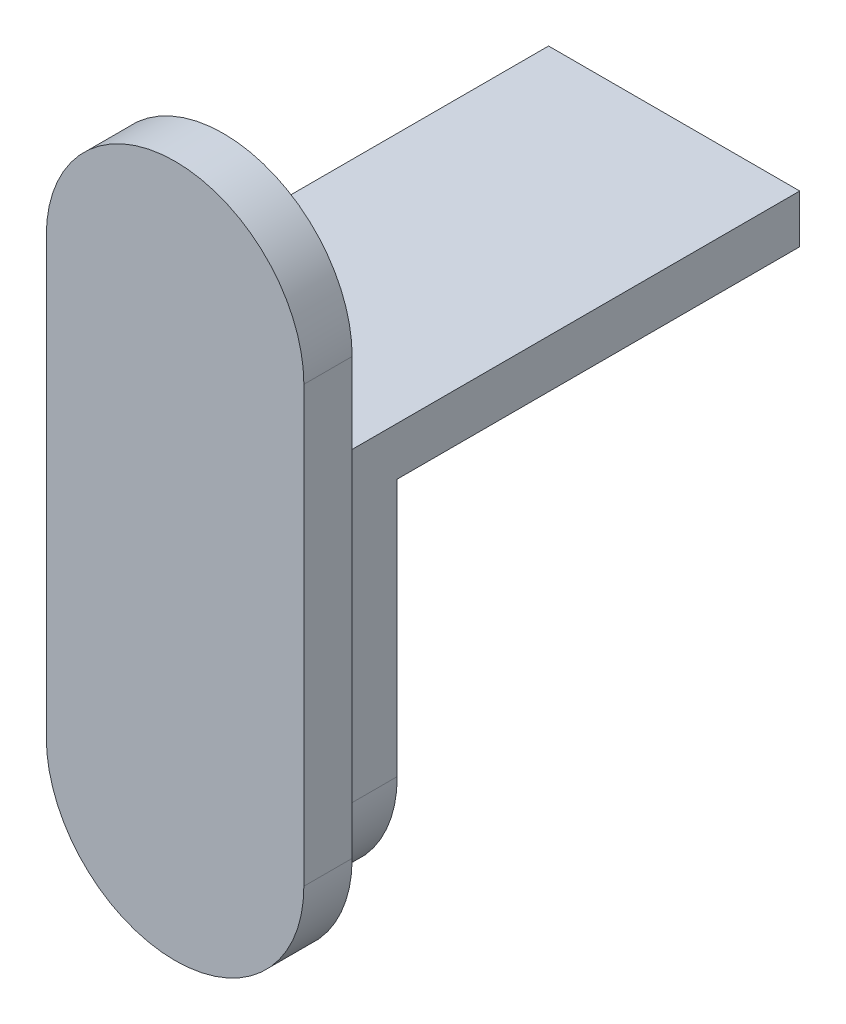
ISO-10303-21;
HEADER;
FILE_DESCRIPTION(('STEP AP214'),'2;1');
FILE_NAME('part.step','',(''),(''),'','','');
FILE_SCHEMA(('AUTOMOTIVE_DESIGN { 1 0 10303 214 1 1 1 1 }'));
ENDSEC;
DATA;
#1=APPLICATION_CONTEXT('core data for automotive mechanical design processes');
#2=APPLICATION_PROTOCOL_DEFINITION('international standard','automotive_design',2000,#1);
#3=PRODUCT_CONTEXT('',#1,'mechanical');
#4=PRODUCT('Part','Part','',(#3));
#5=PRODUCT_RELATED_PRODUCT_CATEGORY('part','',(#4));
#6=PRODUCT_DEFINITION_FORMATION('','',#4);
#7=PRODUCT_DEFINITION_CONTEXT('part definition',#1,'design');
#8=PRODUCT_DEFINITION('design','',#6,#7);
#9=PRODUCT_DEFINITION_SHAPE('','',#8);
#10=(LENGTH_UNIT() NAMED_UNIT(*) SI_UNIT(.MILLI.,.METRE.));
#11=(NAMED_UNIT(*) PLANE_ANGLE_UNIT() SI_UNIT($,.RADIAN.));
#12=(NAMED_UNIT(*) SI_UNIT($,.STERADIAN.) SOLID_ANGLE_UNIT());
#13=UNCERTAINTY_MEASURE_WITH_UNIT(LENGTH_MEASURE(1.E-05),#10,'distance_accuracy_value','');
#14=(GEOMETRIC_REPRESENTATION_CONTEXT(3) GLOBAL_UNCERTAINTY_ASSIGNED_CONTEXT((#13)) GLOBAL_UNIT_ASSIGNED_CONTEXT((#10,
#11,#12)) REPRESENTATION_CONTEXT('',''));
#15=CARTESIAN_POINT('',(0.,0.,0.));
#16=DIRECTION('',(0.,0.,1.));
#17=DIRECTION('',(1.,0.,0.));
#18=AXIS2_PLACEMENT_3D('',#15,#16,#17);
#19=CARTESIAN_POINT('',(0.,-20.,3.));
#20=DIRECTION('',(0.,0.,-1.));
#21=DIRECTION('',(1.,0.,0.));
#22=AXIS2_PLACEMENT_3D('',#19,#20,#21);
#23=CYLINDRICAL_SURFACE('',#22,8.);
#24=CARTESIAN_POINT('',(0.,-20.,0.));
#25=DIRECTION('',(0.,0.,-1.));
#26=DIRECTION('',(-1.,0.,0.));
#27=AXIS2_PLACEMENT_3D('',#24,#25,#26);
#28=CIRCLE('',#27,8.);
#29=CARTESIAN_POINT('',(8.,-20.,0.));
#30=VERTEX_POINT('',#29);
#31=CARTESIAN_POINT('',(-8.,-20.,0.));
#32=VERTEX_POINT('',#31);
#33=EDGE_CURVE('E124',#30,#32,#28,.T.);
#34=ORIENTED_EDGE('',*,*,#33,.F.);
#35=DIRECTION('',(0.,0.,-1.));
#36=VECTOR('',#35,1.);
#37=CARTESIAN_POINT('',(8.,-20.,3.));
#38=LINE('',#37,#36);
#39=CARTESIAN_POINT('',(8.,-20.,3.));
#40=VERTEX_POINT('',#39);
#41=EDGE_CURVE('E123',#40,#30,#38,.T.);
#42=ORIENTED_EDGE('',*,*,#41,.F.);
#43=CARTESIAN_POINT('',(0.,-20.,3.));
#44=DIRECTION('',(0.,0.,-1.));
#45=DIRECTION('',(-1.,0.,0.));
#46=AXIS2_PLACEMENT_3D('',#43,#44,#45);
#47=CIRCLE('',#46,8.);
#48=CARTESIAN_POINT('',(-8.,-20.,3.));
#49=VERTEX_POINT('',#48);
#50=EDGE_CURVE('E118',#40,#49,#47,.T.);
#51=ORIENTED_EDGE('',*,*,#50,.T.);
#52=DIRECTION('',(0.,0.,-1.));
#53=VECTOR('',#52,1.);
#54=CARTESIAN_POINT('',(-8.,-20.,3.));
#55=LINE('',#54,#53);
#56=EDGE_CURVE('E12',#49,#32,#55,.T.);
#57=ORIENTED_EDGE('',*,*,#56,.T.);
#58=EDGE_LOOP('',(#34,#42,#51,#57));
#59=FACE_BOUND('',#58,.T.);
#60=ADVANCED_FACE('F61',(#59),#23,.T.);
#61=CARTESIAN_POINT('',(-8.,-20.,3.));
#62=DIRECTION('',(1.,0.,0.));
#63=DIRECTION('',(0.,0.,1.));
#64=AXIS2_PLACEMENT_3D('',#61,#62,#63);
#65=PLANE('',#64);
#66=DIRECTION('',(0.,1.,0.));
#67=VECTOR('',#66,1.);
#68=CARTESIAN_POINT('',(-8.,-20.,0.));
#69=LINE('',#68,#67);
#70=CARTESIAN_POINT('',(-8.,7.00000000000002,0.));
#71=VERTEX_POINT('',#70);
#72=EDGE_CURVE('E126',#32,#71,#69,.T.);
#73=ORIENTED_EDGE('',*,*,#72,.F.);
#74=ORIENTED_EDGE('',*,*,#56,.F.);
#75=DIRECTION('',(0.,1.,0.));
#76=VECTOR('',#75,1.);
#77=CARTESIAN_POINT('',(-8.,-20.,3.));
#78=LINE('',#77,#76);
#79=CARTESIAN_POINT('',(-8.,7.00000000000002,3.));
#80=VERTEX_POINT('',#79);
#81=EDGE_CURVE('E102',#49,#80,#78,.T.);
#82=ORIENTED_EDGE('',*,*,#81,.T.);
#83=DIRECTION('',(0.,0.,-1.));
#84=VECTOR('',#83,1.);
#85=CARTESIAN_POINT('',(-8.,7.00000000000002,3.));
#86=LINE('',#85,#84);
#87=EDGE_CURVE('E69',#80,#71,#86,.T.);
#88=ORIENTED_EDGE('',*,*,#87,.T.);
#89=EDGE_LOOP('',(#73,#74,#82,#88));
#90=FACE_BOUND('',#89,.T.);
#91=ADVANCED_FACE('F116',(#90),#65,.F.);
#92=CARTESIAN_POINT('',(0.,7.00000000000001,3.));
#93=DIRECTION('',(0.,0.,-1.));
#94=DIRECTION('',(1.,0.,0.));
#95=AXIS2_PLACEMENT_3D('',#92,#93,#94);
#96=CYLINDRICAL_SURFACE('',#95,8.);
#97=CARTESIAN_POINT('',(0.,7.00000000000001,0.));
#98=DIRECTION('',(0.,0.,1.));
#99=DIRECTION('',(1.,0.,0.));
#100=AXIS2_PLACEMENT_3D('',#97,#98,#99);
#101=CIRCLE('',#100,8.);
#102=CARTESIAN_POINT('',(8.,7.00000000000001,0.));
#103=VERTEX_POINT('',#102);
#104=EDGE_CURVE('E112',#103,#71,#101,.T.);
#105=ORIENTED_EDGE('',*,*,#104,.T.);
#106=ORIENTED_EDGE('',*,*,#87,.F.);
#107=CARTESIAN_POINT('',(0.,7.00000000000001,3.));
#108=DIRECTION('',(0.,0.,1.));
#109=DIRECTION('',(1.,0.,0.));
#110=AXIS2_PLACEMENT_3D('',#107,#108,#109);
#111=CIRCLE('',#110,8.);
#112=CARTESIAN_POINT('',(8.,7.00000000000001,3.));
#113=VERTEX_POINT('',#112);
#114=EDGE_CURVE('E105',#113,#80,#111,.T.);
#115=ORIENTED_EDGE('',*,*,#114,.F.);
#116=DIRECTION('',(0.,0.,-1.));
#117=VECTOR('',#116,1.);
#118=CARTESIAN_POINT('',(8.,7.00000000000001,3.));
#119=LINE('',#118,#117);
#120=EDGE_CURVE('E115',#113,#103,#119,.T.);
#121=ORIENTED_EDGE('',*,*,#120,.T.);
#122=EDGE_LOOP('',(#105,#106,#115,#121));
#123=FACE_BOUND('',#122,.T.);
#124=ADVANCED_FACE('F111',(#123),#96,.T.);
#125=CARTESIAN_POINT('',(8.,-20.,3.));
#126=DIRECTION('',(1.,0.,0.));
#127=DIRECTION('',(0.,0.,1.));
#128=AXIS2_PLACEMENT_3D('',#125,#126,#127);
#129=PLANE('',#128);
#130=DIRECTION('',(0.,1.,0.));
#131=VECTOR('',#130,1.);
#132=CARTESIAN_POINT('',(8.,-20.,0.));
#133=LINE('',#132,#131);
#134=EDGE_CURVE('E91',#30,#103,#133,.T.);
#135=ORIENTED_EDGE('',*,*,#134,.T.);
#136=ORIENTED_EDGE('',*,*,#120,.F.);
#137=DIRECTION('',(0.,1.,0.));
#138=VECTOR('',#137,1.);
#139=CARTESIAN_POINT('',(8.,-20.,3.));
#140=LINE('',#139,#138);
#141=EDGE_CURVE('E77',#40,#113,#140,.T.);
#142=ORIENTED_EDGE('',*,*,#141,.F.);
#143=ORIENTED_EDGE('',*,*,#41,.T.);
#144=EDGE_LOOP('',(#135,#136,#142,#143));
#145=FACE_BOUND('',#144,.T.);
#146=ADVANCED_FACE('F135',(#145),#129,.T.);
#147=CARTESIAN_POINT('',(0.,-20.,3.));
#148=DIRECTION('',(0.,0.,1.));
#149=DIRECTION('',(-1.,0.,0.));
#150=AXIS2_PLACEMENT_3D('',#147,#148,#149);
#151=PLANE('',#150);
#152=ORIENTED_EDGE('',*,*,#50,.F.);
#153=ORIENTED_EDGE('',*,*,#141,.T.);
#154=ORIENTED_EDGE('',*,*,#114,.T.);
#155=ORIENTED_EDGE('',*,*,#81,.F.);
#156=EDGE_LOOP('',(#152,#153,#154,#155));
#157=FACE_BOUND('',#156,.T.);
#158=ADVANCED_FACE('F107',(#157),#151,.T.);
#159=CARTESIAN_POINT('',(0.,-20.,0.));
#160=DIRECTION('',(0.,0.,1.));
#161=DIRECTION('',(-1.,0.,0.));
#162=AXIS2_PLACEMENT_3D('',#159,#160,#161);
#163=PLANE('',#162);
#164=ORIENTED_EDGE('',*,*,#33,.T.);
#165=ORIENTED_EDGE('',*,*,#72,.T.);
#166=ORIENTED_EDGE('',*,*,#104,.F.);
#167=ORIENTED_EDGE('',*,*,#134,.F.);
#168=EDGE_LOOP('',(#164,#165,#166,#167));
#169=FACE_BOUND('',#168,.T.);
#170=ADVANCED_FACE('F131',(#169),#163,.F.);
#171=CLOSED_SHELL('',(#60,#91,#124,#146,#158,#170));
#172=MANIFOLD_SOLID_BREP('B2',#171);
#173=CARTESIAN_POINT('',(0.,-17.2,-3.));
#174=DIRECTION('',(0.,0.,1.));
#175=DIRECTION('',(-1.,0.,0.));
#176=AXIS2_PLACEMENT_3D('',#173,#174,#175);
#177=CYLINDRICAL_SURFACE('',#176,7.8);
#178=CARTESIAN_POINT('',(0.,-17.2,0.));
#179=DIRECTION('',(0.,0.,1.));
#180=DIRECTION('',(1.,0.,0.));
#181=AXIS2_PLACEMENT_3D('',#178,#179,#180);
#182=CIRCLE('',#181,7.8);
#183=CARTESIAN_POINT('',(-7.8,-17.2,0.));
#184=VERTEX_POINT('',#183);
#185=CARTESIAN_POINT('',(7.8,-17.2,0.));
#186=VERTEX_POINT('',#185);
#187=EDGE_CURVE('E263',#184,#186,#182,.T.);
#188=ORIENTED_EDGE('',*,*,#187,.F.);
#189=DIRECTION('',(0.,0.,1.));
#190=VECTOR('',#189,1.);
#191=CARTESIAN_POINT('',(-7.8,-17.2,-3.));
#192=LINE('',#191,#190);
#193=CARTESIAN_POINT('',(-7.8,-17.2,-3.));
#194=VERTEX_POINT('',#193);
#195=EDGE_CURVE('E205',#194,#184,#192,.T.);
#196=ORIENTED_EDGE('',*,*,#195,.F.);
#197=CARTESIAN_POINT('',(0.,-17.2,-3.));
#198=DIRECTION('',(0.,0.,1.));
#199=DIRECTION('',(1.,0.,0.));
#200=AXIS2_PLACEMENT_3D('',#197,#198,#199);
#201=CIRCLE('',#200,7.8);
#202=CARTESIAN_POINT('',(7.8,-17.2,-3.));
#203=VERTEX_POINT('',#202);
#204=EDGE_CURVE('E245',#194,#203,#201,.T.);
#205=ORIENTED_EDGE('',*,*,#204,.T.);
#206=DIRECTION('',(0.,0.,1.));
#207=VECTOR('',#206,1.);
#208=CARTESIAN_POINT('',(7.8,-17.2,-3.));
#209=LINE('',#208,#207);
#210=EDGE_CURVE('E59',#203,#186,#209,.T.);
#211=ORIENTED_EDGE('',*,*,#210,.T.);
#212=EDGE_LOOP('',(#188,#196,#205,#211));
#213=FACE_BOUND('',#212,.T.);
#214=ADVANCED_FACE('F197',(#213),#177,.T.);
#215=CARTESIAN_POINT('',(7.8,0.,-3.));
#216=DIRECTION('',(-1.,0.,0.));
#217=DIRECTION('',(0.,0.,-1.));
#218=AXIS2_PLACEMENT_3D('',#215,#216,#217);
#219=PLANE('',#218);
#220=DIRECTION('',(0.,1.,0.));
#221=VECTOR('',#220,1.);
#222=CARTESIAN_POINT('',(7.8,0.,0.));
#223=LINE('',#222,#221);
#224=CARTESIAN_POINT('',(7.8,1.8,0.));
#225=VERTEX_POINT('',#224);
#226=EDGE_CURVE('E226',#186,#225,#223,.T.);
#227=ORIENTED_EDGE('',*,*,#226,.F.);
#228=ORIENTED_EDGE('',*,*,#210,.F.);
#229=DIRECTION('',(0.,1.,0.));
#230=VECTOR('',#229,1.);
#231=CARTESIAN_POINT('',(7.8,0.,-3.));
#232=LINE('',#231,#230);
#233=CARTESIAN_POINT('',(7.8,-1.2,-3.));
#234=VERTEX_POINT('',#233);
#235=EDGE_CURVE('E242',#203,#234,#232,.T.);
#236=ORIENTED_EDGE('',*,*,#235,.T.);
#237=DIRECTION('',(0.,0.,1.));
#238=VECTOR('',#237,1.);
#239=CARTESIAN_POINT('',(7.8,-1.2,-28.));
#240=LINE('',#239,#238);
#241=CARTESIAN_POINT('',(7.8,-1.2,-28.));
#242=VERTEX_POINT('',#241);
#243=EDGE_CURVE('E284',#242,#234,#240,.T.);
#244=ORIENTED_EDGE('',*,*,#243,.F.);
#245=DIRECTION('',(0.,1.,0.));
#246=VECTOR('',#245,1.);
#247=CARTESIAN_POINT('',(7.8,0.,-28.));
#248=LINE('',#247,#246);
#249=CARTESIAN_POINT('',(7.8,1.8,-28.));
#250=VERTEX_POINT('',#249);
#251=EDGE_CURVE('E289',#242,#250,#248,.T.);
#252=ORIENTED_EDGE('',*,*,#251,.T.);
#253=DIRECTION('',(0.,0.,1.));
#254=VECTOR('',#253,1.);
#255=CARTESIAN_POINT('',(7.8,1.8,-28.));
#256=LINE('',#255,#254);
#257=EDGE_CURVE('E286',#250,#225,#256,.T.);
#258=ORIENTED_EDGE('',*,*,#257,.T.);
#259=EDGE_LOOP('',(#227,#228,#236,#244,#252,#258));
#260=FACE_BOUND('',#259,.T.);
#261=ADVANCED_FACE('F249',(#260),#219,.F.);
#262=CARTESIAN_POINT('',(-7.8,0.,-3.));
#263=DIRECTION('',(-1.,0.,0.));
#264=DIRECTION('',(0.,0.,-1.));
#265=AXIS2_PLACEMENT_3D('',#262,#263,#264);
#266=PLANE('',#265);
#267=DIRECTION('',(0.,1.,0.));
#268=VECTOR('',#267,1.);
#269=CARTESIAN_POINT('',(-7.8,0.,0.));
#270=LINE('',#269,#268);
#271=CARTESIAN_POINT('',(-7.8,1.8,0.));
#272=VERTEX_POINT('',#271);
#273=EDGE_CURVE('E253',#184,#272,#270,.T.);
#274=ORIENTED_EDGE('',*,*,#273,.T.);
#275=DIRECTION('',(0.,0.,1.));
#276=VECTOR('',#275,1.);
#277=CARTESIAN_POINT('',(-7.8,1.8,-28.));
#278=LINE('',#277,#276);
#279=CARTESIAN_POINT('',(-7.8,1.8,-28.));
#280=VERTEX_POINT('',#279);
#281=EDGE_CURVE('E258',#280,#272,#278,.T.);
#282=ORIENTED_EDGE('',*,*,#281,.F.);
#283=DIRECTION('',(0.,1.,0.));
#284=VECTOR('',#283,1.);
#285=CARTESIAN_POINT('',(-7.8,0.,-28.));
#286=LINE('',#285,#284);
#287=CARTESIAN_POINT('',(-7.8,-1.2,-28.));
#288=VERTEX_POINT('',#287);
#289=EDGE_CURVE('E296',#288,#280,#286,.T.);
#290=ORIENTED_EDGE('',*,*,#289,.F.);
#291=DIRECTION('',(0.,0.,1.));
#292=VECTOR('',#291,1.);
#293=CARTESIAN_POINT('',(-7.8,-1.2,-28.));
#294=LINE('',#293,#292);
#295=CARTESIAN_POINT('',(-7.8,-1.2,-3.));
#296=VERTEX_POINT('',#295);
#297=EDGE_CURVE('E283',#288,#296,#294,.T.);
#298=ORIENTED_EDGE('',*,*,#297,.T.);
#299=DIRECTION('',(0.,1.,0.));
#300=VECTOR('',#299,1.);
#301=CARTESIAN_POINT('',(-7.8,0.,-3.));
#302=LINE('',#301,#300);
#303=EDGE_CURVE('E213',#194,#296,#302,.T.);
#304=ORIENTED_EDGE('',*,*,#303,.F.);
#305=ORIENTED_EDGE('',*,*,#195,.T.);
#306=EDGE_LOOP('',(#274,#282,#290,#298,#304,#305));
#307=FACE_BOUND('',#306,.T.);
#308=ADVANCED_FACE('F265',(#307),#266,.T.);
#309=CARTESIAN_POINT('',(0.,0.,-3.));
#310=DIRECTION('',(0.,0.,-1.));
#311=DIRECTION('',(1.,0.,0.));
#312=AXIS2_PLACEMENT_3D('',#309,#310,#311);
#313=PLANE('',#312);
#314=ORIENTED_EDGE('',*,*,#204,.F.);
#315=ORIENTED_EDGE('',*,*,#303,.T.);
#316=DIRECTION('',(1.,0.,0.));
#317=VECTOR('',#316,1.);
#318=CARTESIAN_POINT('',(0.,-1.2,-3.));
#319=LINE('',#318,#317);
#320=EDGE_CURVE('E233',#296,#234,#319,.T.);
#321=ORIENTED_EDGE('',*,*,#320,.T.);
#322=ORIENTED_EDGE('',*,*,#235,.F.);
#323=EDGE_LOOP('',(#314,#315,#321,#322));
#324=FACE_BOUND('',#323,.T.);
#325=ADVANCED_FACE('F243',(#324),#313,.T.);
#326=CARTESIAN_POINT('',(0.,0.,0.));
#327=DIRECTION('',(0.,0.,-1.));
#328=DIRECTION('',(1.,0.,0.));
#329=AXIS2_PLACEMENT_3D('',#326,#327,#328);
#330=PLANE('',#329);
#331=ORIENTED_EDGE('',*,*,#187,.T.);
#332=ORIENTED_EDGE('',*,*,#226,.T.);
#333=DIRECTION('',(1.,0.,0.));
#334=VECTOR('',#333,1.);
#335=CARTESIAN_POINT('',(0.,1.8,0.));
#336=LINE('',#335,#334);
#337=EDGE_CURVE('E272',#272,#225,#336,.T.);
#338=ORIENTED_EDGE('',*,*,#337,.F.);
#339=ORIENTED_EDGE('',*,*,#273,.F.);
#340=EDGE_LOOP('',(#331,#332,#338,#339));
#341=FACE_BOUND('',#340,.T.);
#342=ADVANCED_FACE('F269',(#341),#330,.F.);
#343=CARTESIAN_POINT('',(0.,-1.2,-28.));
#344=DIRECTION('',(0.,1.,0.));
#345=DIRECTION('',(0.,0.,-1.));
#346=AXIS2_PLACEMENT_3D('',#343,#344,#345);
#347=PLANE('',#346);
#348=ORIENTED_EDGE('',*,*,#297,.F.);
#349=DIRECTION('',(1.,0.,0.));
#350=VECTOR('',#349,1.);
#351=CARTESIAN_POINT('',(0.,-1.2,-28.));
#352=LINE('',#351,#350);
#353=EDGE_CURVE('E293',#288,#242,#352,.T.);
#354=ORIENTED_EDGE('',*,*,#353,.T.);
#355=ORIENTED_EDGE('',*,*,#243,.T.);
#356=ORIENTED_EDGE('',*,*,#320,.F.);
#357=EDGE_LOOP('',(#348,#354,#355,#356));
#358=FACE_BOUND('',#357,.T.);
#359=ADVANCED_FACE('F305',(#358),#347,.F.);
#360=CARTESIAN_POINT('',(0.,1.8,-28.));
#361=DIRECTION('',(0.,1.,0.));
#362=DIRECTION('',(0.,0.,-1.));
#363=AXIS2_PLACEMENT_3D('',#360,#361,#362);
#364=PLANE('',#363);
#365=ORIENTED_EDGE('',*,*,#337,.T.);
#366=ORIENTED_EDGE('',*,*,#257,.F.);
#367=DIRECTION('',(1.,0.,0.));
#368=VECTOR('',#367,1.);
#369=CARTESIAN_POINT('',(0.,1.8,-28.));
#370=LINE('',#369,#368);
#371=EDGE_CURVE('E276',#280,#250,#370,.T.);
#372=ORIENTED_EDGE('',*,*,#371,.F.);
#373=ORIENTED_EDGE('',*,*,#281,.T.);
#374=EDGE_LOOP('',(#365,#366,#372,#373));
#375=FACE_BOUND('',#374,.T.);
#376=ADVANCED_FACE('F279',(#375),#364,.T.);
#377=CARTESIAN_POINT('',(0.,0.,-28.));
#378=DIRECTION('',(0.,0.,-1.));
#379=DIRECTION('',(1.,0.,0.));
#380=AXIS2_PLACEMENT_3D('',#377,#378,#379);
#381=PLANE('',#380);
#382=ORIENTED_EDGE('',*,*,#371,.T.);
#383=ORIENTED_EDGE('',*,*,#251,.F.);
#384=ORIENTED_EDGE('',*,*,#353,.F.);
#385=ORIENTED_EDGE('',*,*,#289,.T.);
#386=EDGE_LOOP('',(#382,#383,#384,#385));
#387=FACE_BOUND('',#386,.T.);
#388=ADVANCED_FACE('F300',(#387),#381,.T.);
#389=CLOSED_SHELL('',(#214,#261,#308,#325,#342,#359,#376,#388));
#390=MANIFOLD_SOLID_BREP('B6_NOT_SHOWN',#389);
#391=ADVANCED_BREP_SHAPE_REPRESENTATION('',(#18,#172,#390),#14);
#392=SHAPE_DEFINITION_REPRESENTATION(#9,#391);
ENDSEC;
END-ISO-10303-21;
